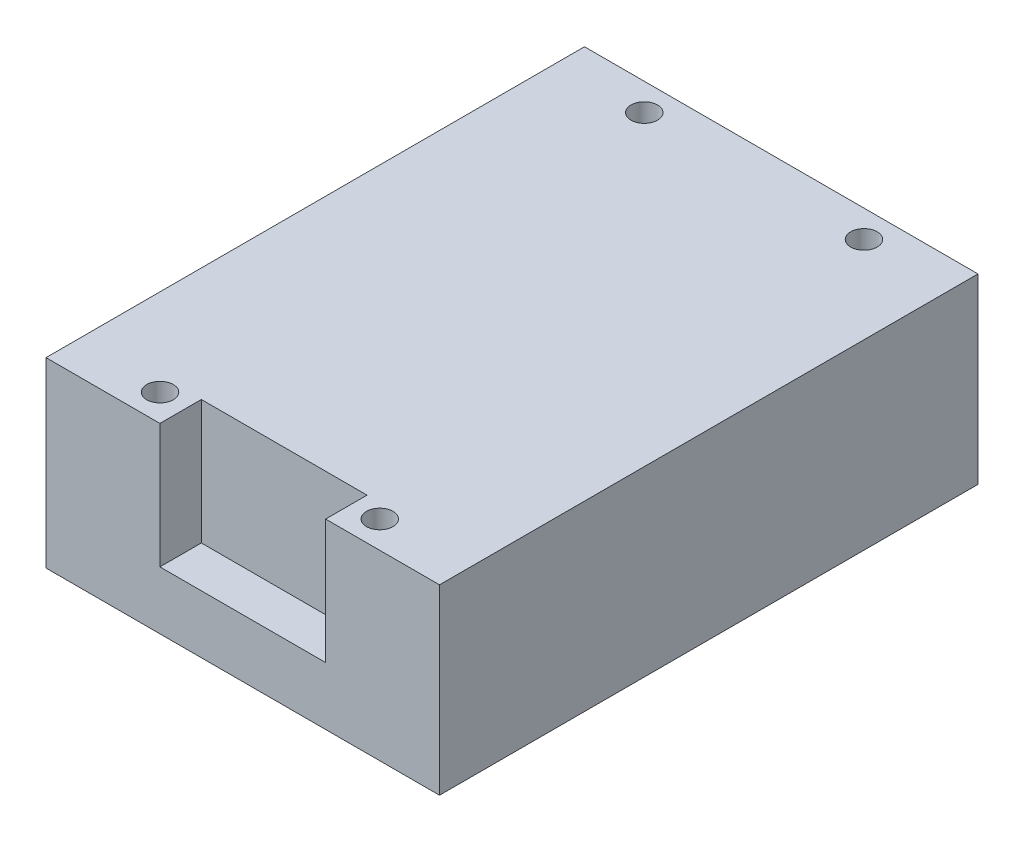
ISO-10303-21;
HEADER;
FILE_DESCRIPTION(('STEP AP214'),'2;1');
FILE_NAME('part.step','',(''),(''),'','','');
FILE_SCHEMA(('AUTOMOTIVE_DESIGN { 1 0 10303 214 1 1 1 1 }'));
ENDSEC;
DATA;
#1=APPLICATION_CONTEXT('core data for automotive mechanical design processes');
#2=APPLICATION_PROTOCOL_DEFINITION('international standard','automotive_design',2000,#1);
#3=PRODUCT_CONTEXT('',#1,'mechanical');
#4=PRODUCT('Part','Part','',(#3));
#5=PRODUCT_RELATED_PRODUCT_CATEGORY('part','',(#4));
#6=PRODUCT_DEFINITION_FORMATION('','',#4);
#7=PRODUCT_DEFINITION_CONTEXT('part definition',#1,'design');
#8=PRODUCT_DEFINITION('design','',#6,#7);
#9=PRODUCT_DEFINITION_SHAPE('','',#8);
#10=(LENGTH_UNIT() NAMED_UNIT(*) SI_UNIT(.MILLI.,.METRE.));
#11=(NAMED_UNIT(*) PLANE_ANGLE_UNIT() SI_UNIT($,.RADIAN.));
#12=(NAMED_UNIT(*) SI_UNIT($,.STERADIAN.) SOLID_ANGLE_UNIT());
#13=UNCERTAINTY_MEASURE_WITH_UNIT(LENGTH_MEASURE(1.E-05),#10,'distance_accuracy_value','');
#14=(GEOMETRIC_REPRESENTATION_CONTEXT(3) GLOBAL_UNCERTAINTY_ASSIGNED_CONTEXT((#13)) GLOBAL_UNIT_ASSIGNED_CONTEXT((#10,
#11,#12)) REPRESENTATION_CONTEXT('',''));
#15=CARTESIAN_POINT('',(0.,0.,0.));
#16=DIRECTION('',(0.,0.,1.));
#17=DIRECTION('',(1.,0.,0.));
#18=AXIS2_PLACEMENT_3D('',#15,#16,#17);
#19=CARTESIAN_POINT('',(23.75,22.,-32.5));
#20=DIRECTION('',(-1.,0.,0.));
#21=DIRECTION('',(0.,0.,1.));
#22=AXIS2_PLACEMENT_3D('',#19,#20,#21);
#23=PLANE('',#22);
#24=DIRECTION('',(0.,0.,-1.));
#25=VECTOR('',#24,1.);
#26=CARTESIAN_POINT('',(23.75,0.,-32.5));
#27=LINE('',#26,#25);
#28=CARTESIAN_POINT('',(23.75,0.,32.5));
#29=VERTEX_POINT('',#28);
#30=CARTESIAN_POINT('',(23.75,0.,-32.5));
#31=VERTEX_POINT('',#30);
#32=EDGE_CURVE('E166',#29,#31,#27,.T.);
#33=ORIENTED_EDGE('',*,*,#32,.T.);
#34=DIRECTION('',(0.,-1.,0.));
#35=VECTOR('',#34,1.);
#36=CARTESIAN_POINT('',(23.75,22.,-32.5));
#37=LINE('',#36,#35);
#38=CARTESIAN_POINT('',(23.75,22.,-32.5));
#39=VERTEX_POINT('',#38);
#40=EDGE_CURVE('E11',#39,#31,#37,.T.);
#41=ORIENTED_EDGE('',*,*,#40,.F.);
#42=DIRECTION('',(0.,0.,-1.));
#43=VECTOR('',#42,1.);
#44=CARTESIAN_POINT('',(23.75,22.,-32.5));
#45=LINE('',#44,#43);
#46=CARTESIAN_POINT('',(23.75,22.,32.5));
#47=VERTEX_POINT('',#46);
#48=EDGE_CURVE('E169',#47,#39,#45,.T.);
#49=ORIENTED_EDGE('',*,*,#48,.F.);
#50=DIRECTION('',(0.,-1.,0.));
#51=VECTOR('',#50,1.);
#52=CARTESIAN_POINT('',(23.75,22.,32.5));
#53=LINE('',#52,#51);
#54=EDGE_CURVE('E176',#47,#29,#53,.T.);
#55=ORIENTED_EDGE('',*,*,#54,.T.);
#56=EDGE_LOOP('',(#33,#41,#49,#55));
#57=FACE_BOUND('',#56,.T.);
#58=ADVANCED_FACE('F34',(#57),#23,.F.);
#59=CARTESIAN_POINT('',(-23.75,22.,-32.5));
#60=DIRECTION('',(0.,0.,1.));
#61=DIRECTION('',(1.,0.,0.));
#62=AXIS2_PLACEMENT_3D('',#59,#60,#61);
#63=PLANE('',#62);
#64=DIRECTION('',(-1.,0.,0.));
#65=VECTOR('',#64,1.);
#66=CARTESIAN_POINT('',(-23.75,0.,-32.5));
#67=LINE('',#66,#65);
#68=CARTESIAN_POINT('',(-23.75,0.,-32.5));
#69=VERTEX_POINT('',#68);
#70=EDGE_CURVE('E179',#31,#69,#67,.T.);
#71=ORIENTED_EDGE('',*,*,#70,.T.);
#72=DIRECTION('',(0.,-1.,0.));
#73=VECTOR('',#72,1.);
#74=CARTESIAN_POINT('',(-23.75,22.,-32.5));
#75=LINE('',#74,#73);
#76=CARTESIAN_POINT('',(-23.75,22.,-32.5));
#77=VERTEX_POINT('',#76);
#78=EDGE_CURVE('E41',#77,#69,#75,.T.);
#79=ORIENTED_EDGE('',*,*,#78,.F.);
#80=DIRECTION('',(-1.,0.,0.));
#81=VECTOR('',#80,1.);
#82=CARTESIAN_POINT('',(-23.75,22.,-32.5));
#83=LINE('',#82,#81);
#84=EDGE_CURVE('E85',#39,#77,#83,.T.);
#85=ORIENTED_EDGE('',*,*,#84,.F.);
#86=ORIENTED_EDGE('',*,*,#40,.T.);
#87=EDGE_LOOP('',(#71,#79,#85,#86));
#88=FACE_BOUND('',#87,.T.);
#89=ADVANCED_FACE('F214',(#88),#63,.F.);
#90=CARTESIAN_POINT('',(-23.75,22.,-32.5));
#91=DIRECTION('',(1.,0.,0.));
#92=DIRECTION('',(0.,0.,-1.));
#93=AXIS2_PLACEMENT_3D('',#90,#91,#92);
#94=PLANE('',#93);
#95=DIRECTION('',(0.,0.,1.));
#96=VECTOR('',#95,1.);
#97=CARTESIAN_POINT('',(-23.75,0.,-32.5));
#98=LINE('',#97,#96);
#99=CARTESIAN_POINT('',(-23.75,0.,32.5));
#100=VERTEX_POINT('',#99);
#101=EDGE_CURVE('E181',#69,#100,#98,.T.);
#102=ORIENTED_EDGE('',*,*,#101,.T.);
#103=DIRECTION('',(0.,-1.,0.));
#104=VECTOR('',#103,1.);
#105=CARTESIAN_POINT('',(-23.75,22.,32.5));
#106=LINE('',#105,#104);
#107=CARTESIAN_POINT('',(-23.75,22.,32.5));
#108=VERTEX_POINT('',#107);
#109=EDGE_CURVE('E185',#108,#100,#106,.T.);
#110=ORIENTED_EDGE('',*,*,#109,.F.);
#111=DIRECTION('',(0.,0.,1.));
#112=VECTOR('',#111,1.);
#113=CARTESIAN_POINT('',(-23.75,22.,-32.5));
#114=LINE('',#113,#112);
#115=EDGE_CURVE('E172',#77,#108,#114,.T.);
#116=ORIENTED_EDGE('',*,*,#115,.F.);
#117=ORIENTED_EDGE('',*,*,#78,.T.);
#118=EDGE_LOOP('',(#102,#110,#116,#117));
#119=FACE_BOUND('',#118,.T.);
#120=ADVANCED_FACE('F190',(#119),#94,.F.);
#121=CARTESIAN_POINT('',(-23.75,22.,32.5));
#122=DIRECTION('',(0.,0.,-1.));
#123=DIRECTION('',(-1.,0.,0.));
#124=AXIS2_PLACEMENT_3D('',#121,#122,#123);
#125=PLANE('',#124);
#126=DIRECTION('',(1.,0.,0.));
#127=VECTOR('',#126,1.);
#128=CARTESIAN_POINT('',(-10.,7.,32.5));
#129=LINE('',#128,#127);
#130=CARTESIAN_POINT('',(-10.,7.,32.5));
#131=VERTEX_POINT('',#130);
#132=CARTESIAN_POINT('',(10.,7.,32.5));
#133=VERTEX_POINT('',#132);
#134=EDGE_CURVE('E124',#131,#133,#129,.T.);
#135=ORIENTED_EDGE('',*,*,#134,.F.);
#136=DIRECTION('',(0.,1.,0.));
#137=VECTOR('',#136,1.);
#138=CARTESIAN_POINT('',(-10.,7.,32.5));
#139=LINE('',#138,#137);
#140=CARTESIAN_POINT('',(-10.,22.,32.5));
#141=VERTEX_POINT('',#140);
#142=EDGE_CURVE('E108',#131,#141,#139,.T.);
#143=ORIENTED_EDGE('',*,*,#142,.T.);
#144=DIRECTION('',(1.,0.,0.));
#145=VECTOR('',#144,1.);
#146=CARTESIAN_POINT('',(-23.75,22.,32.5));
#147=LINE('',#146,#145);
#148=EDGE_CURVE('E174',#108,#141,#147,.T.);
#149=ORIENTED_EDGE('',*,*,#148,.F.);
#150=ORIENTED_EDGE('',*,*,#109,.T.);
#151=DIRECTION('',(1.,0.,0.));
#152=VECTOR('',#151,1.);
#153=CARTESIAN_POINT('',(-23.75,0.,32.5));
#154=LINE('',#153,#152);
#155=EDGE_CURVE('E78',#100,#29,#154,.T.);
#156=ORIENTED_EDGE('',*,*,#155,.T.);
#157=ORIENTED_EDGE('',*,*,#54,.F.);
#158=CARTESIAN_POINT('',(10.,22.,32.5));
#159=VERTEX_POINT('',#158);
#160=EDGE_CURVE('E56',#159,#47,#147,.T.);
#161=ORIENTED_EDGE('',*,*,#160,.F.);
#162=DIRECTION('',(0.,1.,0.));
#163=VECTOR('',#162,1.);
#164=CARTESIAN_POINT('',(10.,7.,32.5));
#165=LINE('',#164,#163);
#166=EDGE_CURVE('E48',#133,#159,#165,.T.);
#167=ORIENTED_EDGE('',*,*,#166,.F.);
#168=EDGE_LOOP('',(#135,#143,#149,#150,#156,#157,#161,#167));
#169=FACE_BOUND('',#168,.T.);
#170=ADVANCED_FACE('F128',(#169),#125,.F.);
#171=CARTESIAN_POINT('',(0.,22.,0.));
#172=DIRECTION('',(0.,1.,0.));
#173=DIRECTION('',(0.,0.,1.));
#174=AXIS2_PLACEMENT_3D('',#171,#172,#173);
#175=PLANE('',#174);
#176=DIRECTION('',(0.,0.,1.));
#177=VECTOR('',#176,1.);
#178=CARTESIAN_POINT('',(-10.,22.,32.5));
#179=LINE('',#178,#177);
#180=CARTESIAN_POINT('',(-10.,22.,27.5));
#181=VERTEX_POINT('',#180);
#182=EDGE_CURVE('E114',#181,#141,#179,.T.);
#183=ORIENTED_EDGE('',*,*,#182,.F.);
#184=DIRECTION('',(-1.,0.,0.));
#185=VECTOR('',#184,1.);
#186=CARTESIAN_POINT('',(-10.,22.,27.5));
#187=LINE('',#186,#185);
#188=CARTESIAN_POINT('',(10.,22.,27.5));
#189=VERTEX_POINT('',#188);
#190=EDGE_CURVE('E126',#189,#181,#187,.T.);
#191=ORIENTED_EDGE('',*,*,#190,.F.);
#192=DIRECTION('',(0.,0.,-1.));
#193=VECTOR('',#192,1.);
#194=CARTESIAN_POINT('',(10.,22.,32.5));
#195=LINE('',#194,#193);
#196=EDGE_CURVE('E135',#159,#189,#195,.T.);
#197=ORIENTED_EDGE('',*,*,#196,.F.);
#198=ORIENTED_EDGE('',*,*,#160,.T.);
#199=ORIENTED_EDGE('',*,*,#48,.T.);
#200=ORIENTED_EDGE('',*,*,#84,.T.);
#201=ORIENTED_EDGE('',*,*,#115,.T.);
#202=ORIENTED_EDGE('',*,*,#148,.T.);
#203=EDGE_LOOP('',(#183,#191,#197,#198,#199,#200,#201,#202));
#204=FACE_BOUND('',#203,.T.);
#205=CARTESIAN_POINT('',(13.26,22.,-29.225));
#206=DIRECTION('',(0.,1.,0.));
#207=DIRECTION('',(0.,0.,1.));
#208=AXIS2_PLACEMENT_3D('',#205,#206,#207);
#209=CIRCLE('',#208,1.6);
#210=CARTESIAN_POINT('',(13.26,22.,-27.625));
#211=VERTEX_POINT('',#210);
#212=EDGE_CURVE('E149',#211,#211,#209,.T.);
#213=ORIENTED_EDGE('',*,*,#212,.F.);
#214=EDGE_LOOP('',(#213));
#215=FACE_BOUND('',#214,.T.);
#216=CARTESIAN_POINT('',(13.26,22.,29.225));
#217=DIRECTION('',(0.,1.,0.));
#218=DIRECTION('',(0.,0.,1.));
#219=AXIS2_PLACEMENT_3D('',#216,#217,#218);
#220=CIRCLE('',#219,1.6);
#221=CARTESIAN_POINT('',(13.26,22.,30.825));
#222=VERTEX_POINT('',#221);
#223=EDGE_CURVE('E155',#222,#222,#220,.T.);
#224=ORIENTED_EDGE('',*,*,#223,.F.);
#225=EDGE_LOOP('',(#224));
#226=FACE_BOUND('',#225,.T.);
#227=CARTESIAN_POINT('',(-13.26,22.,29.225));
#228=DIRECTION('',(0.,1.,0.));
#229=DIRECTION('',(0.,0.,1.));
#230=AXIS2_PLACEMENT_3D('',#227,#228,#229);
#231=CIRCLE('',#230,1.6);
#232=CARTESIAN_POINT('',(-13.26,22.,30.825));
#233=VERTEX_POINT('',#232);
#234=EDGE_CURVE('E141',#233,#233,#231,.T.);
#235=ORIENTED_EDGE('',*,*,#234,.F.);
#236=EDGE_LOOP('',(#235));
#237=FACE_BOUND('',#236,.T.);
#238=CARTESIAN_POINT('',(-13.26,22.,-29.225));
#239=DIRECTION('',(0.,1.,0.));
#240=DIRECTION('',(0.,0.,1.));
#241=AXIS2_PLACEMENT_3D('',#238,#239,#240);
#242=CIRCLE('',#241,1.6);
#243=CARTESIAN_POINT('',(-13.26,22.,-27.625));
#244=VERTEX_POINT('',#243);
#245=EDGE_CURVE('E148',#244,#244,#242,.T.);
#246=ORIENTED_EDGE('',*,*,#245,.F.);
#247=EDGE_LOOP('',(#246));
#248=FACE_BOUND('',#247,.T.);
#249=ADVANCED_FACE('F198',(#204,#215,#226,#237,#248),#175,.T.);
#250=CARTESIAN_POINT('',(0.,0.,0.));
#251=DIRECTION('',(0.,1.,0.));
#252=DIRECTION('',(0.,0.,1.));
#253=AXIS2_PLACEMENT_3D('',#250,#251,#252);
#254=PLANE('',#253);
#255=CARTESIAN_POINT('',(13.26,0.,-29.225));
#256=DIRECTION('',(0.,1.,0.));
#257=DIRECTION('',(0.,0.,1.));
#258=AXIS2_PLACEMENT_3D('',#255,#256,#257);
#259=CIRCLE('',#258,1.6);
#260=CARTESIAN_POINT('',(13.26,0.,-27.625));
#261=VERTEX_POINT('',#260);
#262=EDGE_CURVE('E145',#261,#261,#259,.T.);
#263=ORIENTED_EDGE('',*,*,#262,.T.);
#264=EDGE_LOOP('',(#263));
#265=FACE_BOUND('',#264,.T.);
#266=CARTESIAN_POINT('',(13.26,0.,29.225));
#267=DIRECTION('',(0.,1.,0.));
#268=DIRECTION('',(0.,0.,1.));
#269=AXIS2_PLACEMENT_3D('',#266,#267,#268);
#270=CIRCLE('',#269,1.6);
#271=CARTESIAN_POINT('',(13.26,0.,30.825));
#272=VERTEX_POINT('',#271);
#273=EDGE_CURVE('E152',#272,#272,#270,.T.);
#274=ORIENTED_EDGE('',*,*,#273,.T.);
#275=EDGE_LOOP('',(#274));
#276=FACE_BOUND('',#275,.T.);
#277=CARTESIAN_POINT('',(-13.26,0.,29.225));
#278=DIRECTION('',(0.,1.,0.));
#279=DIRECTION('',(0.,0.,1.));
#280=AXIS2_PLACEMENT_3D('',#277,#278,#279);
#281=CIRCLE('',#280,1.6);
#282=CARTESIAN_POINT('',(-13.26,0.,30.825));
#283=VERTEX_POINT('',#282);
#284=EDGE_CURVE('E158',#283,#283,#281,.T.);
#285=ORIENTED_EDGE('',*,*,#284,.T.);
#286=EDGE_LOOP('',(#285));
#287=FACE_BOUND('',#286,.T.);
#288=CARTESIAN_POINT('',(-13.26,0.,-29.225));
#289=DIRECTION('',(0.,1.,0.));
#290=DIRECTION('',(0.,0.,1.));
#291=AXIS2_PLACEMENT_3D('',#288,#289,#290);
#292=CIRCLE('',#291,1.6);
#293=CARTESIAN_POINT('',(-13.26,0.,-27.625));
#294=VERTEX_POINT('',#293);
#295=EDGE_CURVE('E163',#294,#294,#292,.T.);
#296=ORIENTED_EDGE('',*,*,#295,.T.);
#297=EDGE_LOOP('',(#296));
#298=FACE_BOUND('',#297,.T.);
#299=ORIENTED_EDGE('',*,*,#32,.F.);
#300=ORIENTED_EDGE('',*,*,#155,.F.);
#301=ORIENTED_EDGE('',*,*,#101,.F.);
#302=ORIENTED_EDGE('',*,*,#70,.F.);
#303=EDGE_LOOP('',(#299,#300,#301,#302));
#304=FACE_BOUND('',#303,.T.);
#305=ADVANCED_FACE('F194',(#265,#276,#287,#298,#304),#254,.F.);
#306=CARTESIAN_POINT('',(-13.26,0.,-29.225));
#307=DIRECTION('',(0.,1.,0.));
#308=DIRECTION('',(0.,0.,1.));
#309=AXIS2_PLACEMENT_3D('',#306,#307,#308);
#310=CYLINDRICAL_SURFACE('',#309,1.6);
#311=ORIENTED_EDGE('',*,*,#295,.F.);
#312=EDGE_LOOP('',(#311));
#313=FACE_BOUND('',#312,.T.);
#314=ORIENTED_EDGE('',*,*,#245,.T.);
#315=EDGE_LOOP('',(#314));
#316=FACE_BOUND('',#315,.T.);
#317=ADVANCED_FACE('F227',(#313,#316),#310,.F.);
#318=CARTESIAN_POINT('',(-13.26,0.,29.225));
#319=DIRECTION('',(0.,1.,0.));
#320=DIRECTION('',(0.,0.,1.));
#321=AXIS2_PLACEMENT_3D('',#318,#319,#320);
#322=CYLINDRICAL_SURFACE('',#321,1.6);
#323=ORIENTED_EDGE('',*,*,#284,.F.);
#324=EDGE_LOOP('',(#323));
#325=FACE_BOUND('',#324,.T.);
#326=ORIENTED_EDGE('',*,*,#234,.T.);
#327=EDGE_LOOP('',(#326));
#328=FACE_BOUND('',#327,.T.);
#329=ADVANCED_FACE('F233',(#325,#328),#322,.F.);
#330=CARTESIAN_POINT('',(13.26,0.,29.225));
#331=DIRECTION('',(0.,1.,0.));
#332=DIRECTION('',(0.,0.,1.));
#333=AXIS2_PLACEMENT_3D('',#330,#331,#332);
#334=CYLINDRICAL_SURFACE('',#333,1.6);
#335=ORIENTED_EDGE('',*,*,#273,.F.);
#336=EDGE_LOOP('',(#335));
#337=FACE_BOUND('',#336,.T.);
#338=ORIENTED_EDGE('',*,*,#223,.T.);
#339=EDGE_LOOP('',(#338));
#340=FACE_BOUND('',#339,.T.);
#341=ADVANCED_FACE('F237',(#337,#340),#334,.F.);
#342=CARTESIAN_POINT('',(13.26,0.,-29.225));
#343=DIRECTION('',(0.,1.,0.));
#344=DIRECTION('',(0.,0.,1.));
#345=AXIS2_PLACEMENT_3D('',#342,#343,#344);
#346=CYLINDRICAL_SURFACE('',#345,1.6);
#347=ORIENTED_EDGE('',*,*,#262,.F.);
#348=EDGE_LOOP('',(#347));
#349=FACE_BOUND('',#348,.T.);
#350=ORIENTED_EDGE('',*,*,#212,.T.);
#351=EDGE_LOOP('',(#350));
#352=FACE_BOUND('',#351,.T.);
#353=ADVANCED_FACE('F241',(#349,#352),#346,.F.);
#354=CARTESIAN_POINT('',(-10.,7.,32.5));
#355=DIRECTION('',(-1.,0.,0.));
#356=DIRECTION('',(0.,0.,1.));
#357=AXIS2_PLACEMENT_3D('',#354,#355,#356);
#358=PLANE('',#357);
#359=ORIENTED_EDGE('',*,*,#182,.T.);
#360=ORIENTED_EDGE('',*,*,#142,.F.);
#361=DIRECTION('',(0.,0.,1.));
#362=VECTOR('',#361,1.);
#363=CARTESIAN_POINT('',(-10.,7.,32.5));
#364=LINE('',#363,#362);
#365=CARTESIAN_POINT('',(-10.,7.,27.5));
#366=VERTEX_POINT('',#365);
#367=EDGE_CURVE('E111',#366,#131,#364,.T.);
#368=ORIENTED_EDGE('',*,*,#367,.F.);
#369=DIRECTION('',(0.,1.,0.));
#370=VECTOR('',#369,1.);
#371=CARTESIAN_POINT('',(-10.,7.,27.5));
#372=LINE('',#371,#370);
#373=EDGE_CURVE('E139',#366,#181,#372,.T.);
#374=ORIENTED_EDGE('',*,*,#373,.T.);
#375=EDGE_LOOP('',(#359,#360,#368,#374));
#376=FACE_BOUND('',#375,.T.);
#377=ADVANCED_FACE('F110',(#376),#358,.F.);
#378=CARTESIAN_POINT('',(-10.,7.,27.5));
#379=DIRECTION('',(0.,0.,-1.));
#380=DIRECTION('',(-1.,0.,0.));
#381=AXIS2_PLACEMENT_3D('',#378,#379,#380);
#382=PLANE('',#381);
#383=ORIENTED_EDGE('',*,*,#190,.T.);
#384=ORIENTED_EDGE('',*,*,#373,.F.);
#385=DIRECTION('',(-1.,0.,0.));
#386=VECTOR('',#385,1.);
#387=CARTESIAN_POINT('',(-10.,7.,27.5));
#388=LINE('',#387,#386);
#389=CARTESIAN_POINT('',(10.,7.,27.5));
#390=VERTEX_POINT('',#389);
#391=EDGE_CURVE('E118',#390,#366,#388,.T.);
#392=ORIENTED_EDGE('',*,*,#391,.F.);
#393=DIRECTION('',(0.,1.,0.));
#394=VECTOR('',#393,1.);
#395=CARTESIAN_POINT('',(10.,7.,27.5));
#396=LINE('',#395,#394);
#397=EDGE_CURVE('E142',#390,#189,#396,.T.);
#398=ORIENTED_EDGE('',*,*,#397,.T.);
#399=EDGE_LOOP('',(#383,#384,#392,#398));
#400=FACE_BOUND('',#399,.T.);
#401=ADVANCED_FACE('F202',(#400),#382,.F.);
#402=CARTESIAN_POINT('',(10.,7.,32.5));
#403=DIRECTION('',(1.,0.,0.));
#404=DIRECTION('',(0.,0.,-1.));
#405=AXIS2_PLACEMENT_3D('',#402,#403,#404);
#406=PLANE('',#405);
#407=ORIENTED_EDGE('',*,*,#196,.T.);
#408=ORIENTED_EDGE('',*,*,#397,.F.);
#409=DIRECTION('',(0.,0.,-1.));
#410=VECTOR('',#409,1.);
#411=CARTESIAN_POINT('',(10.,7.,32.5));
#412=LINE('',#411,#410);
#413=EDGE_CURVE('E129',#133,#390,#412,.T.);
#414=ORIENTED_EDGE('',*,*,#413,.F.);
#415=ORIENTED_EDGE('',*,*,#166,.T.);
#416=EDGE_LOOP('',(#407,#408,#414,#415));
#417=FACE_BOUND('',#416,.T.);
#418=ADVANCED_FACE('F203',(#417),#406,.F.);
#419=CARTESIAN_POINT('',(0.,7.,0.));
#420=DIRECTION('',(0.,-1.,0.));
#421=DIRECTION('',(0.,0.,-1.));
#422=AXIS2_PLACEMENT_3D('',#419,#420,#421);
#423=PLANE('',#422);
#424=ORIENTED_EDGE('',*,*,#367,.T.);
#425=ORIENTED_EDGE('',*,*,#134,.T.);
#426=ORIENTED_EDGE('',*,*,#413,.T.);
#427=ORIENTED_EDGE('',*,*,#391,.T.);
#428=EDGE_LOOP('',(#424,#425,#426,#427));
#429=FACE_BOUND('',#428,.T.);
#430=ADVANCED_FACE('F122',(#429),#423,.F.);
#431=CLOSED_SHELL('',(#58,#89,#120,#170,#249,#305,#317,#329,#341,#353,#377,#401,#418,#430));
#432=MANIFOLD_SOLID_BREP('B2',#431);
#433=ADVANCED_BREP_SHAPE_REPRESENTATION('',(#18,#432),#14);
#434=SHAPE_DEFINITION_REPRESENTATION(#9,#433);
ENDSEC;
END-ISO-10303-21;
